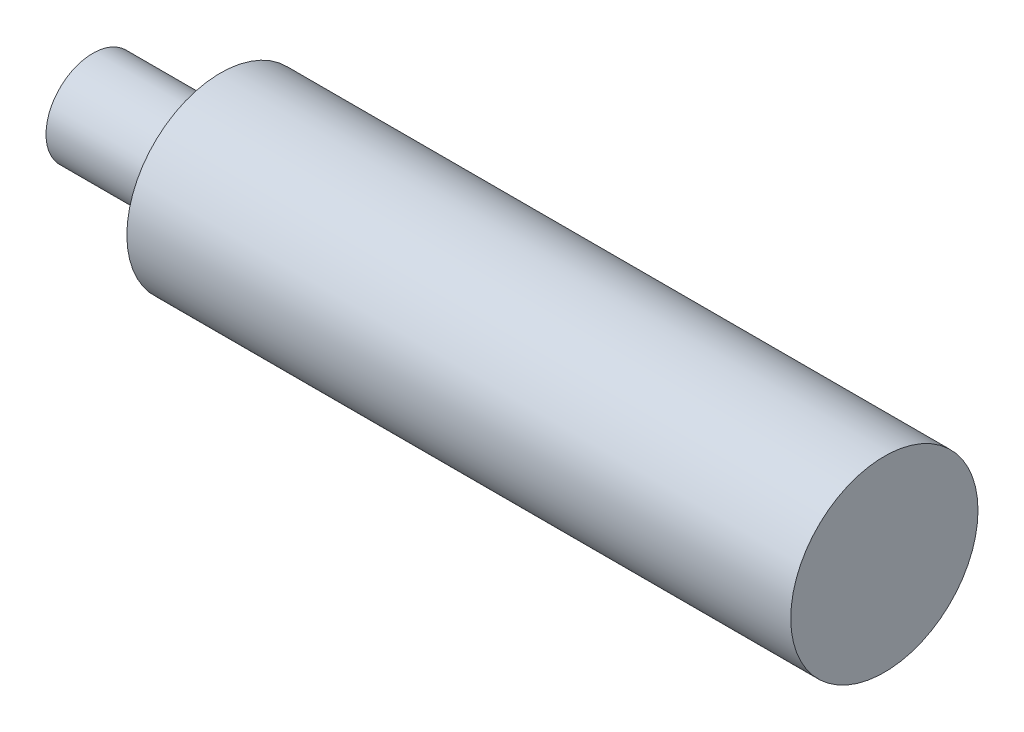
ISO-10303-21;
HEADER;
FILE_DESCRIPTION(('STEP AP214'),'2;1');
FILE_NAME('part.step','',(''),(''),'','','');
FILE_SCHEMA(('AUTOMOTIVE_DESIGN { 1 0 10303 214 1 1 1 1 }'));
ENDSEC;
DATA;
#1=APPLICATION_CONTEXT('core data for automotive mechanical design processes');
#2=APPLICATION_PROTOCOL_DEFINITION('international standard','automotive_design',2000,#1);
#3=PRODUCT_CONTEXT('',#1,'mechanical');
#4=PRODUCT('Part','Part','',(#3));
#5=PRODUCT_RELATED_PRODUCT_CATEGORY('part','',(#4));
#6=PRODUCT_DEFINITION_FORMATION('','',#4);
#7=PRODUCT_DEFINITION_CONTEXT('part definition',#1,'design');
#8=PRODUCT_DEFINITION('design','',#6,#7);
#9=PRODUCT_DEFINITION_SHAPE('','',#8);
#10=(LENGTH_UNIT() NAMED_UNIT(*) SI_UNIT(.MILLI.,.METRE.));
#11=(NAMED_UNIT(*) PLANE_ANGLE_UNIT() SI_UNIT($,.RADIAN.));
#12=(NAMED_UNIT(*) SI_UNIT($,.STERADIAN.) SOLID_ANGLE_UNIT());
#13=UNCERTAINTY_MEASURE_WITH_UNIT(LENGTH_MEASURE(1.E-05),#10,'distance_accuracy_value','');
#14=(GEOMETRIC_REPRESENTATION_CONTEXT(3) GLOBAL_UNCERTAINTY_ASSIGNED_CONTEXT((#13)) GLOBAL_UNIT_ASSIGNED_CONTEXT((#10,
#11,#12)) REPRESENTATION_CONTEXT('',''));
#15=CARTESIAN_POINT('',(0.,0.,0.));
#16=DIRECTION('',(0.,0.,1.));
#17=DIRECTION('',(1.,0.,0.));
#18=AXIS2_PLACEMENT_3D('',#15,#16,#17);
#19=CARTESIAN_POINT('',(236.22,0.,0.));
#20=DIRECTION('',(-1.,0.,0.));
#21=DIRECTION('',(0.,0.,1.));
#22=AXIS2_PLACEMENT_3D('',#19,#20,#21);
#23=CYLINDRICAL_SURFACE('',#22,55.88);
#24=CARTESIAN_POINT('',(236.22,0.,0.));
#25=DIRECTION('',(1.,0.,0.));
#26=DIRECTION('',(0.,0.,-1.));
#27=AXIS2_PLACEMENT_3D('',#24,#25,#26);
#28=CIRCLE('',#27,55.88);
#29=CARTESIAN_POINT('',(236.22,0.,-55.88));
#30=VERTEX_POINT('',#29);
#31=EDGE_CURVE('E11',#30,#30,#28,.T.);
#32=ORIENTED_EDGE('',*,*,#31,.F.);
#33=EDGE_LOOP('',(#32));
#34=FACE_BOUND('',#33,.T.);
#35=CARTESIAN_POINT('',(-160.02,0.,0.));
#36=DIRECTION('',(-1.,0.,0.));
#37=DIRECTION('',(0.,0.,1.));
#38=AXIS2_PLACEMENT_3D('',#35,#36,#37);
#39=CIRCLE('',#38,55.88);
#40=CARTESIAN_POINT('',(-160.02,0.,55.88));
#41=VERTEX_POINT('',#40);
#42=EDGE_CURVE('E35',#41,#41,#39,.T.);
#43=ORIENTED_EDGE('',*,*,#42,.F.);
#44=EDGE_LOOP('',(#43));
#45=FACE_BOUND('',#44,.T.);
#46=ADVANCED_FACE('F32',(#34,#45),#23,.T.);
#47=CARTESIAN_POINT('',(236.22,0.,0.));
#48=DIRECTION('',(1.,0.,0.));
#49=DIRECTION('',(0.,0.,-1.));
#50=AXIS2_PLACEMENT_3D('',#47,#48,#49);
#51=PLANE('',#50);
#52=ORIENTED_EDGE('',*,*,#31,.T.);
#53=EDGE_LOOP('',(#52));
#54=FACE_BOUND('',#53,.T.);
#55=ADVANCED_FACE('F56',(#54),#51,.T.);
#56=CARTESIAN_POINT('',(-160.02,0.,0.));
#57=DIRECTION('',(-1.,0.,0.));
#58=DIRECTION('',(0.,0.,1.));
#59=AXIS2_PLACEMENT_3D('',#56,#57,#58);
#60=PLANE('',#59);
#61=CARTESIAN_POINT('',(-160.02,0.,0.));
#62=DIRECTION('',(-1.,0.,0.));
#63=DIRECTION('',(0.,0.,1.));
#64=AXIS2_PLACEMENT_3D('',#61,#62,#63);
#65=CIRCLE('',#64,27.94);
#66=CARTESIAN_POINT('',(-160.02,0.,27.94));
#67=VERTEX_POINT('',#66);
#68=EDGE_CURVE('E42',#67,#67,#65,.T.);
#69=ORIENTED_EDGE('',*,*,#68,.F.);
#70=EDGE_LOOP('',(#69));
#71=FACE_BOUND('',#70,.T.);
#72=ORIENTED_EDGE('',*,*,#42,.T.);
#73=EDGE_LOOP('',(#72));
#74=FACE_BOUND('',#73,.T.);
#75=ADVANCED_FACE('F53',(#71,#74),#60,.T.);
#76=CARTESIAN_POINT('',(-160.02,0.,0.));
#77=DIRECTION('',(-1.,0.,0.));
#78=DIRECTION('',(0.,0.,1.));
#79=AXIS2_PLACEMENT_3D('',#76,#77,#78);
#80=CYLINDRICAL_SURFACE('',#79,27.94);
#81=CARTESIAN_POINT('',(-236.22,0.,0.));
#82=DIRECTION('',(-1.,0.,0.));
#83=DIRECTION('',(0.,0.,1.));
#84=AXIS2_PLACEMENT_3D('',#81,#82,#83);
#85=CIRCLE('',#84,27.94);
#86=CARTESIAN_POINT('',(-236.22,0.,27.94));
#87=VERTEX_POINT('',#86);
#88=EDGE_CURVE('E44',#87,#87,#85,.T.);
#89=CARTESIAN_POINT('',(-160.02,0.,27.94));
#90=CARTESIAN_POINT('',(-160.81375,0.,27.94));
#91=CARTESIAN_POINT('',(-161.6075,0.,27.94));
#92=CARTESIAN_POINT('',(-163.195,0.,27.94));
#93=CARTESIAN_POINT('',(-163.98875,0.,27.94));
#94=CARTESIAN_POINT('',(-165.57625,0.,27.94));
#95=CARTESIAN_POINT('',(-166.37,0.,27.94));
#96=CARTESIAN_POINT('',(-167.9575,0.,27.94));
#97=CARTESIAN_POINT('',(-168.75125,0.,27.94));
#98=CARTESIAN_POINT('',(-170.33875,0.,27.94));
#99=CARTESIAN_POINT('',(-171.1325,0.,27.94));
#100=CARTESIAN_POINT('',(-172.72,0.,27.94));
#101=CARTESIAN_POINT('',(-173.51375,0.,27.94));
#102=CARTESIAN_POINT('',(-175.10125,0.,27.94));
#103=CARTESIAN_POINT('',(-175.895,0.,27.94));
#104=CARTESIAN_POINT('',(-177.4825,0.,27.94));
#105=CARTESIAN_POINT('',(-178.27625,0.,27.94));
#106=CARTESIAN_POINT('',(-179.86375,0.,27.94));
#107=CARTESIAN_POINT('',(-180.6575,0.,27.94));
#108=CARTESIAN_POINT('',(-182.245,0.,27.94));
#109=CARTESIAN_POINT('',(-183.03875,0.,27.94));
#110=CARTESIAN_POINT('',(-184.62625,0.,27.94));
#111=CARTESIAN_POINT('',(-185.42,0.,27.94));
#112=CARTESIAN_POINT('',(-187.0075,0.,27.94));
#113=CARTESIAN_POINT('',(-187.80125,0.,27.94));
#114=CARTESIAN_POINT('',(-189.38875,0.,27.94));
#115=CARTESIAN_POINT('',(-190.1825,0.,27.94));
#116=CARTESIAN_POINT('',(-191.77,0.,27.94));
#117=CARTESIAN_POINT('',(-192.56375,0.,27.94));
#118=CARTESIAN_POINT('',(-194.15125,0.,27.94));
#119=CARTESIAN_POINT('',(-194.945,0.,27.94));
#120=CARTESIAN_POINT('',(-196.5325,0.,27.94));
#121=CARTESIAN_POINT('',(-197.32625,0.,27.94));
#122=CARTESIAN_POINT('',(-198.91375,0.,27.94));
#123=CARTESIAN_POINT('',(-199.7075,0.,27.94));
#124=CARTESIAN_POINT('',(-201.295,0.,27.94));
#125=CARTESIAN_POINT('',(-202.08875,0.,27.94));
#126=CARTESIAN_POINT('',(-203.67625,0.,27.94));
#127=CARTESIAN_POINT('',(-204.47,0.,27.94));
#128=CARTESIAN_POINT('',(-206.0575,0.,27.94));
#129=CARTESIAN_POINT('',(-206.85125,0.,27.94));
#130=CARTESIAN_POINT('',(-208.43875,0.,27.94));
#131=CARTESIAN_POINT('',(-209.2325,0.,27.94));
#132=CARTESIAN_POINT('',(-210.82,0.,27.94));
#133=CARTESIAN_POINT('',(-211.61375,0.,27.94));
#134=CARTESIAN_POINT('',(-213.20125,0.,27.94));
#135=CARTESIAN_POINT('',(-213.995,0.,27.94));
#136=CARTESIAN_POINT('',(-215.5825,0.,27.94));
#137=CARTESIAN_POINT('',(-216.37625,0.,27.94));
#138=CARTESIAN_POINT('',(-217.96375,0.,27.94));
#139=CARTESIAN_POINT('',(-218.7575,0.,27.94));
#140=CARTESIAN_POINT('',(-220.345,0.,27.94));
#141=CARTESIAN_POINT('',(-221.13875,0.,27.94));
#142=CARTESIAN_POINT('',(-222.72625,0.,27.94));
#143=CARTESIAN_POINT('',(-223.52,0.,27.94));
#144=CARTESIAN_POINT('',(-225.1075,0.,27.94));
#145=CARTESIAN_POINT('',(-225.90125,0.,27.94));
#146=CARTESIAN_POINT('',(-227.48875,0.,27.94));
#147=CARTESIAN_POINT('',(-228.2825,0.,27.94));
#148=CARTESIAN_POINT('',(-229.87,0.,27.94));
#149=CARTESIAN_POINT('',(-230.66375,0.,27.94));
#150=CARTESIAN_POINT('',(-232.25125,0.,27.94));
#151=CARTESIAN_POINT('',(-233.045,0.,27.94));
#152=CARTESIAN_POINT('',(-234.6325,0.,27.94));
#153=CARTESIAN_POINT('',(-235.42625,0.,27.94));
#154=CARTESIAN_POINT('',(-236.22,0.,27.94));
#155=B_SPLINE_CURVE_WITH_KNOTS('',3,(#89,#90,#91,#92,#93,#94,#95,#96,#97,#98,#99,#100,#101,#102,
#103,#104,#105,#106,#107,#108,#109,#110,#111,#112,#113,#114,#115,#116,#117,#118,#119,#120,#121,
#122,#123,#124,#125,#126,#127,#128,#129,#130,#131,#132,#133,#134,#135,#136,#137,#138,#139,#140,
#141,#142,#143,#144,#145,#146,#147,#148,#149,#150,#151,#152,#153,#154),.UNSPECIFIED.,.F.,.F.,(4,
2,2,2,2,2,2,2,2,2,2,2,2,2,2,2,2,2,2,2,2,2,2,2,2,2,2,2,2,2,2,2,4),(0.,2.38124999999997,
4.76249999999998,7.14374999999998,9.52499999999998,11.90625,14.2875,16.66875,19.05,21.43125,
23.8125,26.19375,28.575,30.95625,33.3375,35.71875,38.1,40.48125,42.8625,45.24375,47.625,
50.00625,52.3875,54.76875,57.15,59.53125,61.9125,64.29375,66.675,69.05625,71.4375,73.81875,
76.2),.UNSPECIFIED.);
#156=EDGE_CURVE('BSEAM50',#67,#87,#155,.T.);
#157=ORIENTED_EDGE('',*,*,#68,.T.);
#158=ORIENTED_EDGE('',*,*,#88,.F.);
#159=ORIENTED_EDGE('',*,*,#156,.T.);
#160=ORIENTED_EDGE('',*,*,#156,.F.);
#161=EDGE_LOOP('',(#157,#159,#158,#160));
#162=FACE_BOUND('',#161,.T.);
#163=ADVANCED_FACE('F50',(#162),#80,.T.);
#164=CARTESIAN_POINT('',(-236.22,0.,0.));
#165=DIRECTION('',(1.,0.,0.));
#166=DIRECTION('',(0.,0.,-1.));
#167=AXIS2_PLACEMENT_3D('',#164,#165,#166);
#168=PLANE('',#167);
#169=ORIENTED_EDGE('',*,*,#88,.T.);
#170=EDGE_LOOP('',(#169));
#171=FACE_BOUND('',#170,.T.);
#172=ADVANCED_FACE('F71',(#171),#168,.F.);
#173=CLOSED_SHELL('',(#46,#55,#75,#163,#172));
#174=MANIFOLD_SOLID_BREP('B2',#173);
#175=ADVANCED_BREP_SHAPE_REPRESENTATION('',(#18,#174),#14);
#176=SHAPE_DEFINITION_REPRESENTATION(#9,#175);
ENDSEC;
END-ISO-10303-21;
